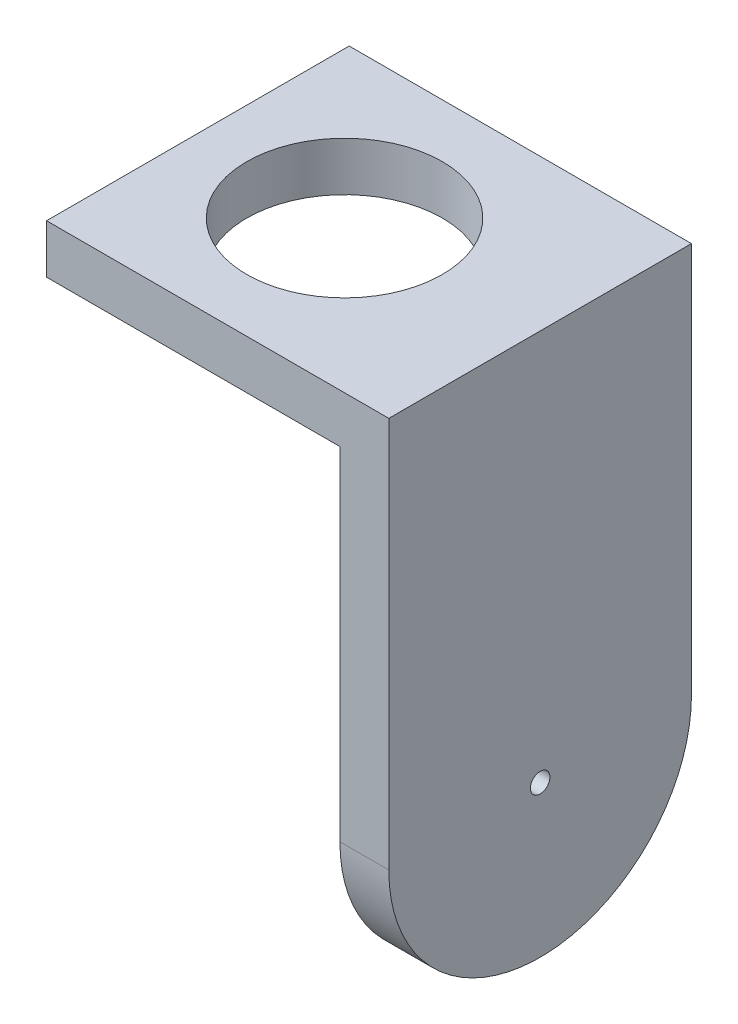
ISO-10303-21;
HEADER;
FILE_DESCRIPTION(('STEP AP214'),'2;1');
FILE_NAME('part.step','',(''),(''),'','','');
FILE_SCHEMA(('AUTOMOTIVE_DESIGN { 1 0 10303 214 1 1 1 1 }'));
ENDSEC;
DATA;
#1=APPLICATION_CONTEXT('core data for automotive mechanical design processes');
#2=APPLICATION_PROTOCOL_DEFINITION('international standard','automotive_design',2000,#1);
#3=PRODUCT_CONTEXT('',#1,'mechanical');
#4=PRODUCT('Part','Part','',(#3));
#5=PRODUCT_RELATED_PRODUCT_CATEGORY('part','',(#4));
#6=PRODUCT_DEFINITION_FORMATION('','',#4);
#7=PRODUCT_DEFINITION_CONTEXT('part definition',#1,'design');
#8=PRODUCT_DEFINITION('design','',#6,#7);
#9=PRODUCT_DEFINITION_SHAPE('','',#8);
#10=(LENGTH_UNIT() NAMED_UNIT(*) SI_UNIT(.MILLI.,.METRE.));
#11=(NAMED_UNIT(*) PLANE_ANGLE_UNIT() SI_UNIT($,.RADIAN.));
#12=(NAMED_UNIT(*) SI_UNIT($,.STERADIAN.) SOLID_ANGLE_UNIT());
#13=UNCERTAINTY_MEASURE_WITH_UNIT(LENGTH_MEASURE(1.E-05),#10,'distance_accuracy_value','');
#14=(GEOMETRIC_REPRESENTATION_CONTEXT(3) GLOBAL_UNCERTAINTY_ASSIGNED_CONTEXT((#13)) GLOBAL_UNIT_ASSIGNED_CONTEXT((#10,
#11,#12)) REPRESENTATION_CONTEXT('',''));
#15=CARTESIAN_POINT('',(0.,0.,0.));
#16=DIRECTION('',(0.,0.,1.));
#17=DIRECTION('',(1.,0.,0.));
#18=AXIS2_PLACEMENT_3D('',#15,#16,#17);
#19=CARTESIAN_POINT('',(0.,-100.931791336827,0.));
#20=DIRECTION('',(1.,0.,0.));
#21=DIRECTION('',(0.,0.,-1.));
#22=AXIS2_PLACEMENT_3D('',#19,#20,#21);
#23=PLANE('',#22);
#24=CARTESIAN_POINT('',(0.,-100.931791336827,0.));
#25=DIRECTION('',(-1.,0.,0.));
#26=DIRECTION('',(0.,0.,1.));
#27=AXIS2_PLACEMENT_3D('',#24,#25,#26);
#28=CIRCLE('',#27,1.);
#29=CARTESIAN_POINT('',(0.,-100.931791336827,0.999999999999972));
#30=VERTEX_POINT('',#29);
#31=EDGE_CURVE('E117',#30,#30,#28,.T.);
#32=ORIENTED_EDGE('',*,*,#31,.F.);
#33=EDGE_LOOP('',(#32));
#34=FACE_BOUND('',#33,.T.);
#35=DIRECTION('',(0.,0.,1.));
#36=VECTOR('',#35,1.);
#37=CARTESIAN_POINT('',(0.,-65.931791336827,-15.4730873507334));
#38=LINE('',#37,#36);
#39=CARTESIAN_POINT('',(0.,-65.931791336827,-15.4730873507334));
#40=VERTEX_POINT('',#39);
#41=CARTESIAN_POINT('',(0.,-65.931791336827,15.4730873507333));
#42=VERTEX_POINT('',#41);
#43=EDGE_CURVE('E48',#40,#42,#38,.T.);
#44=ORIENTED_EDGE('',*,*,#43,.F.);
#45=DIRECTION('',(0.,1.,0.));
#46=VECTOR('',#45,1.);
#47=CARTESIAN_POINT('',(0.,-60.931791336827,-15.4730873507334));
#48=LINE('',#47,#46);
#49=CARTESIAN_POINT('',(0.,-100.931791336827,-15.4730873507334));
#50=VERTEX_POINT('',#49);
#51=EDGE_CURVE('E116',#50,#40,#48,.T.);
#52=ORIENTED_EDGE('',*,*,#51,.F.);
#53=CARTESIAN_POINT('',(0.,-100.931791336827,0.));
#54=DIRECTION('',(1.,0.,0.));
#55=DIRECTION('',(0.,0.,-1.));
#56=AXIS2_PLACEMENT_3D('',#53,#54,#55);
#57=CIRCLE('',#56,15.4730873507333);
#58=CARTESIAN_POINT('',(0.,-100.931791336827,15.4730873507333));
#59=VERTEX_POINT('',#58);
#60=EDGE_CURVE('E72',#59,#50,#57,.T.);
#61=ORIENTED_EDGE('',*,*,#60,.F.);
#62=DIRECTION('',(0.,-1.,0.));
#63=VECTOR('',#62,1.);
#64=CARTESIAN_POINT('',(0.,-60.931791336827,15.4730873507333));
#65=LINE('',#64,#63);
#66=EDGE_CURVE('E135',#42,#59,#65,.T.);
#67=ORIENTED_EDGE('',*,*,#66,.F.);
#68=EDGE_LOOP('',(#44,#52,#61,#67));
#69=FACE_BOUND('',#68,.T.);
#70=ADVANCED_FACE('F33',(#34,#69),#23,.F.);
#71=CARTESIAN_POINT('',(5.,-60.931791336827,-15.4730873507334));
#72=DIRECTION('',(0.,0.,1.));
#73=DIRECTION('',(0.,-1.,0.));
#74=AXIS2_PLACEMENT_3D('',#71,#72,#73);
#75=PLANE('',#74);
#76=ORIENTED_EDGE('',*,*,#51,.T.);
#77=DIRECTION('',(1.,0.,0.));
#78=VECTOR('',#77,1.);
#79=CARTESIAN_POINT('',(-30.,-65.931791336827,-15.4730873507334));
#80=LINE('',#79,#78);
#81=CARTESIAN_POINT('',(-30.,-65.931791336827,-15.4730873507334));
#82=VERTEX_POINT('',#81);
#83=EDGE_CURVE('E99',#82,#40,#80,.T.);
#84=ORIENTED_EDGE('',*,*,#83,.F.);
#85=DIRECTION('',(0.,-1.,0.));
#86=VECTOR('',#85,1.);
#87=CARTESIAN_POINT('',(-30.,-60.931791336827,-15.4730873507334));
#88=LINE('',#87,#86);
#89=CARTESIAN_POINT('',(-30.,-60.931791336827,-15.4730873507334));
#90=VERTEX_POINT('',#89);
#91=EDGE_CURVE('E106',#90,#82,#88,.T.);
#92=ORIENTED_EDGE('',*,*,#91,.F.);
#93=DIRECTION('',(-1.,0.,0.));
#94=VECTOR('',#93,1.);
#95=CARTESIAN_POINT('',(5.,-60.931791336827,-15.4730873507334));
#96=LINE('',#95,#94);
#97=CARTESIAN_POINT('',(5.,-60.931791336827,-15.4730873507334));
#98=VERTEX_POINT('',#97);
#99=EDGE_CURVE('E11',#98,#90,#96,.T.);
#100=ORIENTED_EDGE('',*,*,#99,.F.);
#101=DIRECTION('',(0.,1.,0.));
#102=VECTOR('',#101,1.);
#103=CARTESIAN_POINT('',(5.,-60.931791336827,-15.4730873507334));
#104=LINE('',#103,#102);
#105=CARTESIAN_POINT('',(5.,-100.931791336827,-15.4730873507334));
#106=VERTEX_POINT('',#105);
#107=EDGE_CURVE('E127',#106,#98,#104,.T.);
#108=ORIENTED_EDGE('',*,*,#107,.F.);
#109=DIRECTION('',(-1.,0.,0.));
#110=VECTOR('',#109,1.);
#111=CARTESIAN_POINT('',(5.,-100.931791336827,-15.4730873507334));
#112=LINE('',#111,#110);
#113=EDGE_CURVE('E133',#106,#50,#112,.T.);
#114=ORIENTED_EDGE('',*,*,#113,.T.);
#115=EDGE_LOOP('',(#76,#84,#92,#100,#108,#114));
#116=FACE_BOUND('',#115,.T.);
#117=ADVANCED_FACE('F35',(#116),#75,.F.);
#118=CARTESIAN_POINT('',(5.,-60.931791336827,-15.4730873507334));
#119=DIRECTION('',(0.,-1.,0.));
#120=DIRECTION('',(0.,0.,-1.));
#121=AXIS2_PLACEMENT_3D('',#118,#119,#120);
#122=PLANE('',#121);
#123=CARTESIAN_POINT('',(-15.,-60.931791336827,0.));
#124=DIRECTION('',(0.,-1.,0.));
#125=DIRECTION('',(0.,0.,-1.));
#126=AXIS2_PLACEMENT_3D('',#123,#124,#125);
#127=CIRCLE('',#126,10.);
#128=CARTESIAN_POINT('',(-15.,-60.931791336827,-10.));
#129=VERTEX_POINT('',#128);
#130=EDGE_CURVE('E147',#129,#129,#127,.T.);
#131=ORIENTED_EDGE('',*,*,#130,.T.);
#132=EDGE_LOOP('',(#131));
#133=FACE_BOUND('',#132,.T.);
#134=ORIENTED_EDGE('',*,*,#99,.T.);
#135=DIRECTION('',(0.,0.,-1.));
#136=VECTOR('',#135,1.);
#137=CARTESIAN_POINT('',(-30.,-60.931791336827,-15.4730873507334));
#138=LINE('',#137,#136);
#139=CARTESIAN_POINT('',(-30.,-60.931791336827,15.4730873507333));
#140=VERTEX_POINT('',#139);
#141=EDGE_CURVE('E112',#140,#90,#138,.T.);
#142=ORIENTED_EDGE('',*,*,#141,.F.);
#143=DIRECTION('',(-1.,0.,0.));
#144=VECTOR('',#143,1.);
#145=CARTESIAN_POINT('',(5.,-60.931791336827,15.4730873507333));
#146=LINE('',#145,#144);
#147=CARTESIAN_POINT('',(5.,-60.931791336827,15.4730873507333));
#148=VERTEX_POINT('',#147);
#149=EDGE_CURVE('E41',#148,#140,#146,.T.);
#150=ORIENTED_EDGE('',*,*,#149,.F.);
#151=DIRECTION('',(0.,0.,1.));
#152=VECTOR('',#151,1.);
#153=CARTESIAN_POINT('',(5.,-60.931791336827,-15.4730873507334));
#154=LINE('',#153,#152);
#155=EDGE_CURVE('E79',#98,#148,#154,.T.);
#156=ORIENTED_EDGE('',*,*,#155,.F.);
#157=EDGE_LOOP('',(#134,#142,#150,#156));
#158=FACE_BOUND('',#157,.T.);
#159=ADVANCED_FACE('F145',(#133,#158),#122,.F.);
#160=CARTESIAN_POINT('',(5.,-60.931791336827,15.4730873507333));
#161=DIRECTION('',(0.,0.,-1.));
#162=DIRECTION('',(0.,1.,0.));
#163=AXIS2_PLACEMENT_3D('',#160,#161,#162);
#164=PLANE('',#163);
#165=ORIENTED_EDGE('',*,*,#149,.T.);
#166=DIRECTION('',(0.,1.,0.));
#167=VECTOR('',#166,1.);
#168=CARTESIAN_POINT('',(-30.,-60.931791336827,15.4730873507333));
#169=LINE('',#168,#167);
#170=CARTESIAN_POINT('',(-30.,-65.931791336827,15.4730873507333));
#171=VERTEX_POINT('',#170);
#172=EDGE_CURVE('E105',#171,#140,#169,.T.);
#173=ORIENTED_EDGE('',*,*,#172,.F.);
#174=DIRECTION('',(1.,0.,0.));
#175=VECTOR('',#174,1.);
#176=CARTESIAN_POINT('',(-30.,-65.931791336827,15.4730873507333));
#177=LINE('',#176,#175);
#178=EDGE_CURVE('E101',#171,#42,#177,.T.);
#179=ORIENTED_EDGE('',*,*,#178,.T.);
#180=ORIENTED_EDGE('',*,*,#66,.T.);
#181=DIRECTION('',(-1.,0.,0.));
#182=VECTOR('',#181,1.);
#183=CARTESIAN_POINT('',(5.,-100.931791336827,15.4730873507333));
#184=LINE('',#183,#182);
#185=CARTESIAN_POINT('',(5.,-100.931791336827,15.4730873507333));
#186=VERTEX_POINT('',#185);
#187=EDGE_CURVE('E139',#186,#59,#184,.T.);
#188=ORIENTED_EDGE('',*,*,#187,.F.);
#189=DIRECTION('',(0.,-1.,0.));
#190=VECTOR('',#189,1.);
#191=CARTESIAN_POINT('',(5.,-60.931791336827,15.4730873507333));
#192=LINE('',#191,#190);
#193=EDGE_CURVE('E130',#148,#186,#192,.T.);
#194=ORIENTED_EDGE('',*,*,#193,.F.);
#195=EDGE_LOOP('',(#165,#173,#179,#180,#188,#194));
#196=FACE_BOUND('',#195,.T.);
#197=ADVANCED_FACE('F142',(#196),#164,.F.);
#198=CARTESIAN_POINT('',(5.,-100.931791336827,0.));
#199=DIRECTION('',(-1.,0.,0.));
#200=DIRECTION('',(0.,0.,1.));
#201=AXIS2_PLACEMENT_3D('',#198,#199,#200);
#202=CYLINDRICAL_SURFACE('',#201,15.4730873507333);
#203=ORIENTED_EDGE('',*,*,#60,.T.);
#204=ORIENTED_EDGE('',*,*,#113,.F.);
#205=CARTESIAN_POINT('',(5.,-100.931791336827,0.));
#206=DIRECTION('',(1.,0.,0.));
#207=DIRECTION('',(0.,0.,-1.));
#208=AXIS2_PLACEMENT_3D('',#205,#206,#207);
#209=CIRCLE('',#208,15.4730873507333);
#210=EDGE_CURVE('E57',#186,#106,#209,.T.);
#211=ORIENTED_EDGE('',*,*,#210,.F.);
#212=ORIENTED_EDGE('',*,*,#187,.T.);
#213=EDGE_LOOP('',(#203,#204,#211,#212));
#214=FACE_BOUND('',#213,.T.);
#215=ADVANCED_FACE('F180',(#214),#202,.T.);
#216=CARTESIAN_POINT('',(5.,-100.931791336827,0.));
#217=DIRECTION('',(1.,0.,0.));
#218=DIRECTION('',(0.,0.,-1.));
#219=AXIS2_PLACEMENT_3D('',#216,#217,#218);
#220=PLANE('',#219);
#221=CARTESIAN_POINT('',(5.,-100.931791336827,0.));
#222=DIRECTION('',(-1.,0.,0.));
#223=DIRECTION('',(0.,0.,1.));
#224=AXIS2_PLACEMENT_3D('',#221,#222,#223);
#225=CIRCLE('',#224,1.);
#226=CARTESIAN_POINT('',(5.,-100.931791336827,0.999999999999972));
#227=VERTEX_POINT('',#226);
#228=EDGE_CURVE('E120',#227,#227,#225,.T.);
#229=ORIENTED_EDGE('',*,*,#228,.T.);
#230=EDGE_LOOP('',(#229));
#231=FACE_BOUND('',#230,.T.);
#232=ORIENTED_EDGE('',*,*,#107,.T.);
#233=ORIENTED_EDGE('',*,*,#155,.T.);
#234=ORIENTED_EDGE('',*,*,#193,.T.);
#235=ORIENTED_EDGE('',*,*,#210,.T.);
#236=EDGE_LOOP('',(#232,#233,#234,#235));
#237=FACE_BOUND('',#236,.T.);
#238=ADVANCED_FACE('F168',(#231,#237),#220,.T.);
#239=CARTESIAN_POINT('',(5.,-100.931791336827,0.));
#240=DIRECTION('',(-1.,0.,0.));
#241=DIRECTION('',(0.,0.,1.));
#242=AXIS2_PLACEMENT_3D('',#239,#240,#241);
#243=CYLINDRICAL_SURFACE('',#242,1.);
#244=ORIENTED_EDGE('',*,*,#228,.F.);
#245=EDGE_LOOP('',(#244));
#246=FACE_BOUND('',#245,.T.);
#247=ORIENTED_EDGE('',*,*,#31,.T.);
#248=EDGE_LOOP('',(#247));
#249=FACE_BOUND('',#248,.T.);
#250=ADVANCED_FACE('F161',(#246,#249),#243,.F.);
#251=CARTESIAN_POINT('',(-30.,-65.931791336827,-15.4730873507334));
#252=DIRECTION('',(0.,1.,0.));
#253=DIRECTION('',(0.,0.,1.));
#254=AXIS2_PLACEMENT_3D('',#251,#252,#253);
#255=PLANE('',#254);
#256=CARTESIAN_POINT('',(-15.,-65.931791336827,0.));
#257=DIRECTION('',(0.,-1.,0.));
#258=DIRECTION('',(0.,0.,-1.));
#259=AXIS2_PLACEMENT_3D('',#256,#257,#258);
#260=CIRCLE('',#259,10.);
#261=CARTESIAN_POINT('',(-15.,-65.931791336827,-10.));
#262=VERTEX_POINT('',#261);
#263=EDGE_CURVE('E149',#262,#262,#260,.T.);
#264=ORIENTED_EDGE('',*,*,#263,.F.);
#265=EDGE_LOOP('',(#264));
#266=FACE_BOUND('',#265,.T.);
#267=ORIENTED_EDGE('',*,*,#43,.T.);
#268=ORIENTED_EDGE('',*,*,#178,.F.);
#269=DIRECTION('',(0.,0.,1.));
#270=VECTOR('',#269,1.);
#271=CARTESIAN_POINT('',(-30.,-65.931791336827,-15.4730873507334));
#272=LINE('',#271,#270);
#273=EDGE_CURVE('E95',#82,#171,#272,.T.);
#274=ORIENTED_EDGE('',*,*,#273,.F.);
#275=ORIENTED_EDGE('',*,*,#83,.T.);
#276=EDGE_LOOP('',(#267,#268,#274,#275));
#277=FACE_BOUND('',#276,.T.);
#278=ADVANCED_FACE('F97',(#266,#277),#255,.F.);
#279=CARTESIAN_POINT('',(-30.,0.,0.));
#280=DIRECTION('',(-1.,0.,0.));
#281=DIRECTION('',(0.,0.,1.));
#282=AXIS2_PLACEMENT_3D('',#279,#280,#281);
#283=PLANE('',#282);
#284=ORIENTED_EDGE('',*,*,#91,.T.);
#285=ORIENTED_EDGE('',*,*,#273,.T.);
#286=ORIENTED_EDGE('',*,*,#172,.T.);
#287=ORIENTED_EDGE('',*,*,#141,.T.);
#288=EDGE_LOOP('',(#284,#285,#286,#287));
#289=FACE_BOUND('',#288,.T.);
#290=ADVANCED_FACE('F110',(#289),#283,.T.);
#291=CARTESIAN_POINT('',(-15.,-35.931791336827,0.));
#292=DIRECTION('',(0.,-1.,0.));
#293=DIRECTION('',(0.,0.,-1.));
#294=AXIS2_PLACEMENT_3D('',#291,#292,#293);
#295=CYLINDRICAL_SURFACE('',#294,10.);
#296=ORIENTED_EDGE('',*,*,#263,.T.);
#297=EDGE_LOOP('',(#296));
#298=FACE_BOUND('',#297,.T.);
#299=ORIENTED_EDGE('',*,*,#130,.F.);
#300=EDGE_LOOP('',(#299));
#301=FACE_BOUND('',#300,.T.);
#302=ADVANCED_FACE('F157',(#298,#301),#295,.F.);
#303=CLOSED_SHELL('',(#70,#117,#159,#197,#215,#238,#250,#278,#290,#302));
#304=MANIFOLD_SOLID_BREP('B2',#303);
#305=ADVANCED_BREP_SHAPE_REPRESENTATION('',(#18,#304),#14);
#306=SHAPE_DEFINITION_REPRESENTATION(#9,#305);
ENDSEC;
END-ISO-10303-21;
